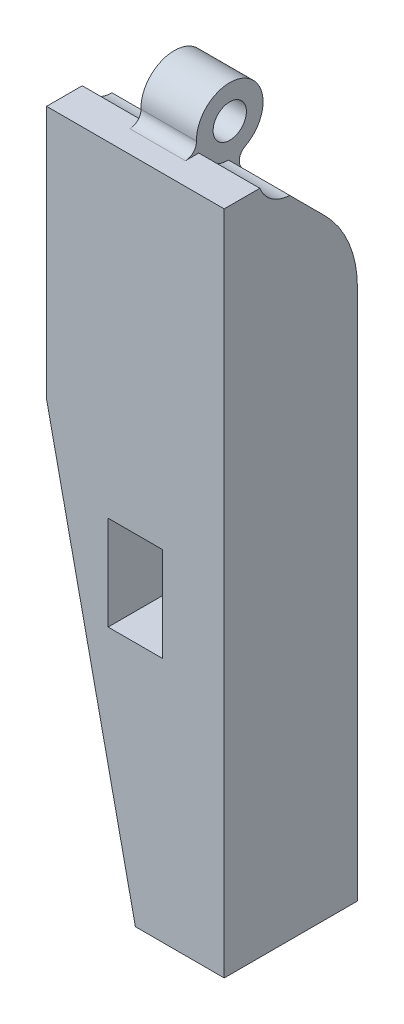
ISO-10303-21;
HEADER;
FILE_DESCRIPTION(('STEP AP214'),'2;1');
FILE_NAME('part.step','',(''),(''),'','','');
FILE_SCHEMA(('AUTOMOTIVE_DESIGN { 1 0 10303 214 1 1 1 1 }'));
ENDSEC;
DATA;
#1=APPLICATION_CONTEXT('core data for automotive mechanical design processes');
#2=APPLICATION_PROTOCOL_DEFINITION('international standard','automotive_design',2000,#1);
#3=PRODUCT_CONTEXT('',#1,'mechanical');
#4=PRODUCT('Part','Part','',(#3));
#5=PRODUCT_RELATED_PRODUCT_CATEGORY('part','',(#4));
#6=PRODUCT_DEFINITION_FORMATION('','',#4);
#7=PRODUCT_DEFINITION_CONTEXT('part definition',#1,'design');
#8=PRODUCT_DEFINITION('design','',#6,#7);
#9=PRODUCT_DEFINITION_SHAPE('','',#8);
#10=(LENGTH_UNIT() NAMED_UNIT(*) SI_UNIT(.MILLI.,.METRE.));
#11=(NAMED_UNIT(*) PLANE_ANGLE_UNIT() SI_UNIT($,.RADIAN.));
#12=(NAMED_UNIT(*) SI_UNIT($,.STERADIAN.) SOLID_ANGLE_UNIT());
#13=UNCERTAINTY_MEASURE_WITH_UNIT(LENGTH_MEASURE(1.E-05),#10,'distance_accuracy_value','');
#14=(GEOMETRIC_REPRESENTATION_CONTEXT(3) GLOBAL_UNCERTAINTY_ASSIGNED_CONTEXT((#13)) GLOBAL_UNIT_ASSIGNED_CONTEXT((#10,
#11,#12)) REPRESENTATION_CONTEXT('',''));
#15=CARTESIAN_POINT('',(0.,0.,0.));
#16=DIRECTION('',(0.,0.,1.));
#17=DIRECTION('',(1.,0.,0.));
#18=AXIS2_PLACEMENT_3D('',#15,#16,#17);
#19=CARTESIAN_POINT('',(0.,-29.3580775066502,5.));
#20=DIRECTION('',(0.,-1.,0.));
#21=DIRECTION('',(0.,0.,-1.));
#22=AXIS2_PLACEMENT_3D('',#19,#20,#21);
#23=PLANE('',#22);
#24=DIRECTION('',(-1.,0.,0.));
#25=VECTOR('',#24,1.);
#26=CARTESIAN_POINT('',(2.45664929848685,-29.3580775066502,2.5));
#27=LINE('',#26,#25);
#28=CARTESIAN_POINT('',(2.45664929848685,-29.3580775066502,2.5));
#29=VERTEX_POINT('',#28);
#30=CARTESIAN_POINT('',(-2.45664929848684,-29.3580775066502,2.5));
#31=VERTEX_POINT('',#30);
#32=EDGE_CURVE('E202',#29,#31,#27,.T.);
#33=ORIENTED_EDGE('',*,*,#32,.T.);
#34=DIRECTION('',(0.,0.,-1.));
#35=VECTOR('',#34,1.);
#36=CARTESIAN_POINT('',(-2.45664929848684,-29.3580775066502,5.));
#37=LINE('',#36,#35);
#38=CARTESIAN_POINT('',(-2.45664929848684,-29.3580775066502,0.));
#39=VERTEX_POINT('',#38);
#40=EDGE_CURVE('E214',#31,#39,#37,.T.);
#41=ORIENTED_EDGE('',*,*,#40,.T.);
#42=DIRECTION('',(-1.,0.,0.));
#43=VECTOR('',#42,1.);
#44=CARTESIAN_POINT('',(0.,-29.3580775066502,0.));
#45=LINE('',#44,#43);
#46=CARTESIAN_POINT('',(2.45664929848685,-29.3580775066502,0.));
#47=VERTEX_POINT('',#46);
#48=EDGE_CURVE('E496',#47,#39,#45,.T.);
#49=ORIENTED_EDGE('',*,*,#48,.F.);
#50=DIRECTION('',(0.,0.,-1.));
#51=VECTOR('',#50,1.);
#52=CARTESIAN_POINT('',(2.45664929848685,-29.3580775066502,5.));
#53=LINE('',#52,#51);
#54=EDGE_CURVE('E216',#29,#47,#53,.T.);
#55=ORIENTED_EDGE('',*,*,#54,.F.);
#56=EDGE_LOOP('',(#33,#41,#49,#55));
#57=FACE_BOUND('',#56,.T.);
#58=ADVANCED_FACE('F38',(#57),#23,.T.);
#59=CARTESIAN_POINT('',(0.,0.,0.));
#60=DIRECTION('',(0.,0.,1.));
#61=DIRECTION('',(1.,0.,0.));
#62=AXIS2_PLACEMENT_3D('',#59,#60,#61);
#63=PLANE('',#62);
#64=DIRECTION('',(0.,-1.,0.));
#65=VECTOR('',#64,1.);
#66=CARTESIAN_POINT('',(-2.45664929848684,0.,0.));
#67=LINE('',#66,#65);
#68=CARTESIAN_POINT('',(-2.45664929848684,-37.8516487579866,0.));
#69=VERTEX_POINT('',#68);
#70=EDGE_CURVE('E221',#39,#69,#67,.T.);
#71=ORIENTED_EDGE('',*,*,#70,.T.);
#72=DIRECTION('',(-1.,0.,0.));
#73=VECTOR('',#72,1.);
#74=CARTESIAN_POINT('',(0.,-37.8516487579866,0.));
#75=LINE('',#74,#73);
#76=CARTESIAN_POINT('',(2.45664929848685,-37.8516487579866,0.));
#77=VERTEX_POINT('',#76);
#78=EDGE_CURVE('E225',#77,#69,#75,.T.);
#79=ORIENTED_EDGE('',*,*,#78,.F.);
#80=DIRECTION('',(0.,-1.,0.));
#81=VECTOR('',#80,1.);
#82=CARTESIAN_POINT('',(2.45664929848685,0.,0.));
#83=LINE('',#82,#81);
#84=EDGE_CURVE('E230',#47,#77,#83,.T.);
#85=ORIENTED_EDGE('',*,*,#84,.F.);
#86=ORIENTED_EDGE('',*,*,#48,.T.);
#87=EDGE_LOOP('',(#71,#79,#85,#86));
#88=FACE_BOUND('',#87,.T.);
#89=DIRECTION('',(0.,1.,0.));
#90=VECTOR('',#89,1.);
#91=CARTESIAN_POINT('',(2.45664929848685,0.,0.));
#92=LINE('',#91,#90);
#93=CARTESIAN_POINT('',(2.45664929848685,-20.4574129456105,0.));
#94=VERTEX_POINT('',#93);
#95=CARTESIAN_POINT('',(2.45664929848685,-12.142135623731,0.));
#96=VERTEX_POINT('',#95);
#97=EDGE_CURVE('E481',#94,#96,#92,.T.);
#98=ORIENTED_EDGE('',*,*,#97,.T.);
#99=DIRECTION('',(1.,0.,0.));
#100=VECTOR('',#99,1.);
#101=CARTESIAN_POINT('',(0.,-12.142135623731,0.));
#102=LINE('',#101,#100);
#103=CARTESIAN_POINT('',(8.,-12.142135623731,0.));
#104=VERTEX_POINT('',#103);
#105=EDGE_CURVE('E372',#96,#104,#102,.T.);
#106=ORIENTED_EDGE('',*,*,#105,.T.);
#107=DIRECTION('',(0.,1.,0.));
#108=VECTOR('',#107,1.);
#109=CARTESIAN_POINT('',(8.,0.,0.));
#110=LINE('',#109,#108);
#111=CARTESIAN_POINT('',(8.00000000000001,-60.,0.));
#112=VERTEX_POINT('',#111);
#113=EDGE_CURVE('E291',#112,#104,#110,.T.);
#114=ORIENTED_EDGE('',*,*,#113,.F.);
#115=DIRECTION('',(1.,0.,0.));
#116=VECTOR('',#115,1.);
#117=CARTESIAN_POINT('',(-8.,-60.,0.));
#118=LINE('',#117,#116);
#119=CARTESIAN_POINT('',(0.,-60.,0.));
#120=VERTEX_POINT('',#119);
#121=EDGE_CURVE('E297',#120,#112,#118,.T.);
#122=ORIENTED_EDGE('',*,*,#121,.F.);
#123=DIRECTION('',(0.210526315789474,-0.977588190579301,0.));
#124=VECTOR('',#123,1.);
#125=CARTESIAN_POINT('',(0.,-60.,0.));
#126=LINE('',#125,#124);
#127=CARTESIAN_POINT('',(-8.,-22.8516487579866,0.));
#128=VERTEX_POINT('',#127);
#129=EDGE_CURVE('E241',#128,#120,#126,.T.);
#130=ORIENTED_EDGE('',*,*,#129,.F.);
#131=DIRECTION('',(0.,-1.,0.));
#132=VECTOR('',#131,1.);
#133=CARTESIAN_POINT('',(-8.,0.,0.));
#134=LINE('',#133,#132);
#135=CARTESIAN_POINT('',(-8.,-12.142135623731,0.));
#136=VERTEX_POINT('',#135);
#137=EDGE_CURVE('E311',#136,#128,#134,.T.);
#138=ORIENTED_EDGE('',*,*,#137,.F.);
#139=CARTESIAN_POINT('',(-2.45664929848684,-12.142135623731,0.));
#140=VERTEX_POINT('',#139);
#141=EDGE_CURVE('E373',#136,#140,#102,.T.);
#142=ORIENTED_EDGE('',*,*,#141,.T.);
#143=DIRECTION('',(0.,1.,0.));
#144=VECTOR('',#143,1.);
#145=CARTESIAN_POINT('',(-2.45664929848684,0.,0.));
#146=LINE('',#145,#144);
#147=CARTESIAN_POINT('',(-2.45664929848684,-20.4574129456105,0.));
#148=VERTEX_POINT('',#147);
#149=EDGE_CURVE('E402',#148,#140,#146,.T.);
#150=ORIENTED_EDGE('',*,*,#149,.F.);
#151=DIRECTION('',(-1.,0.,0.));
#152=VECTOR('',#151,1.);
#153=CARTESIAN_POINT('',(0.,-20.4574129456105,0.));
#154=LINE('',#153,#152);
#155=EDGE_CURVE('E477',#94,#148,#154,.T.);
#156=ORIENTED_EDGE('',*,*,#155,.F.);
#157=EDGE_LOOP('',(#98,#106,#114,#122,#130,#138,#142,#150,#156));
#158=FACE_BOUND('',#157,.T.);
#159=ADVANCED_FACE('F400',(#88,#158),#63,.F.);
#160=CARTESIAN_POINT('',(-8.,1.1,6.));
#161=DIRECTION('',(1.,0.,0.));
#162=DIRECTION('',(0.,0.,-1.));
#163=AXIS2_PLACEMENT_3D('',#160,#161,#162);
#164=CYLINDRICAL_SURFACE('',#163,3.);
#165=CARTESIAN_POINT('',(-2.5,1.1,6.));
#166=DIRECTION('',(1.,0.,0.));
#167=DIRECTION('',(0.,0.,-1.));
#168=AXIS2_PLACEMENT_3D('',#165,#166,#167);
#169=CIRCLE('',#168,3.);
#170=CARTESIAN_POINT('',(-2.5,0.,8.79105714739057));
#171=VERTEX_POINT('',#170);
#172=CARTESIAN_POINT('',(-2.5,-1.89827483579602,6.10172516420397));
#173=VERTEX_POINT('',#172);
#174=EDGE_CURVE('E267',#171,#173,#169,.T.);
#175=ORIENTED_EDGE('',*,*,#174,.T.);
#176=DIRECTION('',(1.,0.,0.));
#177=VECTOR('',#176,1.);
#178=CARTESIAN_POINT('',(-8.,-1.89827483579602,6.10172516420397));
#179=LINE('',#178,#177);
#180=CARTESIAN_POINT('',(-8.,-1.89827483579602,6.10172516420397));
#181=VERTEX_POINT('',#180);
#182=EDGE_CURVE('E328',#181,#173,#179,.T.);
#183=ORIENTED_EDGE('',*,*,#182,.F.);
#184=CARTESIAN_POINT('',(-8.,1.1,6.));
#185=DIRECTION('',(1.,0.,0.));
#186=DIRECTION('',(0.,0.,-1.));
#187=AXIS2_PLACEMENT_3D('',#184,#185,#186);
#188=CIRCLE('',#187,3.);
#189=CARTESIAN_POINT('',(-8.,0.,8.79105714739057));
#190=VERTEX_POINT('',#189);
#191=EDGE_CURVE('E274',#190,#181,#188,.T.);
#192=ORIENTED_EDGE('',*,*,#191,.F.);
#193=DIRECTION('',(1.,0.,0.));
#194=VECTOR('',#193,1.);
#195=CARTESIAN_POINT('',(-8.,0.,8.79105714739057));
#196=LINE('',#195,#194);
#197=EDGE_CURVE('E278',#171,#190,#196,.F.);
#198=ORIENTED_EDGE('',*,*,#197,.F.);
#199=EDGE_LOOP('',(#175,#183,#192,#198));
#200=FACE_BOUND('',#199,.T.);
#201=ADVANCED_FACE('F429',(#200),#164,.F.);
#202=CARTESIAN_POINT('',(8.,0.,12.));
#203=DIRECTION('',(-1.,0.,0.));
#204=DIRECTION('',(0.,-1.,0.));
#205=AXIS2_PLACEMENT_3D('',#202,#203,#204);
#206=PLANE('',#205);
#207=ORIENTED_EDGE('',*,*,#113,.T.);
#208=CARTESIAN_POINT('',(8.,-12.142135623731,10.));
#209=DIRECTION('',(-1.,0.,0.));
#210=DIRECTION('',(0.,-1.,0.));
#211=AXIS2_PLACEMENT_3D('',#208,#209,#210);
#212=CIRCLE('',#211,10.);
#213=CARTESIAN_POINT('',(8.00000000000001,-5.07106781186548,2.92893218813452));
#214=VERTEX_POINT('',#213);
#215=EDGE_CURVE('E377',#104,#214,#212,.F.);
#216=ORIENTED_EDGE('',*,*,#215,.T.);
#217=DIRECTION('',(0.,-0.707106781186548,-0.707106781186547));
#218=VECTOR('',#217,1.);
#219=CARTESIAN_POINT('',(8.00000000000001,0.,8.));
#220=LINE('',#219,#218);
#221=CARTESIAN_POINT('',(8.00000000000001,-1.89827483579602,6.10172516420397));
#222=VERTEX_POINT('',#221);
#223=EDGE_CURVE('E283',#222,#214,#220,.T.);
#224=ORIENTED_EDGE('',*,*,#223,.F.);
#225=CARTESIAN_POINT('',(8.00000000000001,1.1,6.));
#226=DIRECTION('',(1.,0.,0.));
#227=DIRECTION('',(0.,0.,-1.));
#228=AXIS2_PLACEMENT_3D('',#225,#226,#227);
#229=CIRCLE('',#228,3.);
#230=CARTESIAN_POINT('',(8.00000000000001,0.,8.79105714739057));
#231=VERTEX_POINT('',#230);
#232=EDGE_CURVE('E265',#231,#222,#229,.T.);
#233=ORIENTED_EDGE('',*,*,#232,.F.);
#234=DIRECTION('',(0.,0.,-1.));
#235=VECTOR('',#234,1.);
#236=CARTESIAN_POINT('',(8.,0.,12.));
#237=LINE('',#236,#235);
#238=CARTESIAN_POINT('',(8.,0.,12.));
#239=VERTEX_POINT('',#238);
#240=EDGE_CURVE('E323',#239,#231,#237,.T.);
#241=ORIENTED_EDGE('',*,*,#240,.F.);
#242=DIRECTION('',(0.,1.,0.));
#243=VECTOR('',#242,1.);
#244=CARTESIAN_POINT('',(8.,0.,12.));
#245=LINE('',#244,#243);
#246=CARTESIAN_POINT('',(8.00000000000001,-60.,12.));
#247=VERTEX_POINT('',#246);
#248=EDGE_CURVE('E292',#247,#239,#245,.T.);
#249=ORIENTED_EDGE('',*,*,#248,.F.);
#250=DIRECTION('',(0.,0.,-1.));
#251=VECTOR('',#250,1.);
#252=CARTESIAN_POINT('',(8.00000000000001,-60.,12.));
#253=LINE('',#252,#251);
#254=EDGE_CURVE('E307',#247,#112,#253,.T.);
#255=ORIENTED_EDGE('',*,*,#254,.T.);
#256=EDGE_LOOP('',(#207,#216,#224,#233,#241,#249,#255));
#257=FACE_BOUND('',#256,.T.);
#258=ADVANCED_FACE('F419',(#257),#206,.F.);
#259=CARTESIAN_POINT('',(-8.,0.,12.));
#260=DIRECTION('',(0.,-1.,0.));
#261=DIRECTION('',(1.,0.,0.));
#262=AXIS2_PLACEMENT_3D('',#259,#260,#261);
#263=PLANE('',#262);
#264=DIRECTION('',(1.,0.,0.));
#265=VECTOR('',#264,1.);
#266=CARTESIAN_POINT('',(-2.5,0.,9.99874980462644));
#267=LINE('',#266,#265);
#268=CARTESIAN_POINT('',(2.5,0.,9.99874980462644));
#269=VERTEX_POINT('',#268);
#270=CARTESIAN_POINT('',(-2.5,0.,9.99874980462644));
#271=VERTEX_POINT('',#270);
#272=EDGE_CURVE('E336',#269,#271,#267,.F.);
#273=ORIENTED_EDGE('',*,*,#272,.T.);
#274=DIRECTION('',(0.,0.,-1.));
#275=VECTOR('',#274,1.);
#276=CARTESIAN_POINT('',(-2.5,0.,6.));
#277=LINE('',#276,#275);
#278=EDGE_CURVE('E340',#271,#171,#277,.T.);
#279=ORIENTED_EDGE('',*,*,#278,.T.);
#280=ORIENTED_EDGE('',*,*,#197,.T.);
#281=DIRECTION('',(0.,0.,-1.));
#282=VECTOR('',#281,1.);
#283=CARTESIAN_POINT('',(-8.,0.,12.));
#284=LINE('',#283,#282);
#285=CARTESIAN_POINT('',(-8.,0.,12.));
#286=VERTEX_POINT('',#285);
#287=EDGE_CURVE('E319',#286,#190,#284,.T.);
#288=ORIENTED_EDGE('',*,*,#287,.F.);
#289=DIRECTION('',(-1.,0.,0.));
#290=VECTOR('',#289,1.);
#291=CARTESIAN_POINT('',(-8.,0.,12.));
#292=LINE('',#291,#290);
#293=EDGE_CURVE('E296',#239,#286,#292,.T.);
#294=ORIENTED_EDGE('',*,*,#293,.F.);
#295=ORIENTED_EDGE('',*,*,#240,.T.);
#296=CARTESIAN_POINT('',(2.5,0.,8.79105714739057));
#297=VERTEX_POINT('',#296);
#298=EDGE_CURVE('E279',#231,#297,#196,.F.);
#299=ORIENTED_EDGE('',*,*,#298,.T.);
#300=DIRECTION('',(0.,0.,1.));
#301=VECTOR('',#300,1.);
#302=CARTESIAN_POINT('',(2.5,0.,12.));
#303=LINE('',#302,#301);
#304=EDGE_CURVE('E332',#297,#269,#303,.T.);
#305=ORIENTED_EDGE('',*,*,#304,.T.);
#306=EDGE_LOOP('',(#273,#279,#280,#288,#294,#295,#299,#305));
#307=FACE_BOUND('',#306,.T.);
#308=ADVANCED_FACE('F423',(#307),#263,.F.);
#309=CARTESIAN_POINT('',(-8.,0.,12.));
#310=DIRECTION('',(1.,0.,0.));
#311=DIRECTION('',(0.,0.,-1.));
#312=AXIS2_PLACEMENT_3D('',#309,#310,#311);
#313=PLANE('',#312);
#314=DIRECTION('',(0.,-0.707106781186548,-0.707106781186547));
#315=VECTOR('',#314,1.);
#316=CARTESIAN_POINT('',(-8.,0.,8.));
#317=LINE('',#316,#315);
#318=CARTESIAN_POINT('',(-8.,-5.07106781186548,2.92893218813452));
#319=VERTEX_POINT('',#318);
#320=EDGE_CURVE('E287',#181,#319,#317,.T.);
#321=ORIENTED_EDGE('',*,*,#320,.T.);
#322=CARTESIAN_POINT('',(-8.,-12.142135623731,10.));
#323=DIRECTION('',(1.,0.,0.));
#324=DIRECTION('',(0.,0.,-1.));
#325=AXIS2_PLACEMENT_3D('',#322,#323,#324);
#326=CIRCLE('',#325,10.);
#327=EDGE_CURVE('E11',#319,#136,#326,.F.);
#328=ORIENTED_EDGE('',*,*,#327,.T.);
#329=ORIENTED_EDGE('',*,*,#137,.T.);
#330=DIRECTION('',(0.,0.,-1.));
#331=VECTOR('',#330,1.);
#332=CARTESIAN_POINT('',(-8.,-22.8516487579866,12.));
#333=LINE('',#332,#331);
#334=CARTESIAN_POINT('',(-8.,-22.8516487579866,12.));
#335=VERTEX_POINT('',#334);
#336=EDGE_CURVE('E240',#335,#128,#333,.T.);
#337=ORIENTED_EDGE('',*,*,#336,.F.);
#338=DIRECTION('',(0.,-1.,0.));
#339=VECTOR('',#338,1.);
#340=CARTESIAN_POINT('',(-8.,0.,12.));
#341=LINE('',#340,#339);
#342=EDGE_CURVE('E300',#286,#335,#341,.T.);
#343=ORIENTED_EDGE('',*,*,#342,.F.);
#344=ORIENTED_EDGE('',*,*,#287,.T.);
#345=ORIENTED_EDGE('',*,*,#191,.T.);
#346=EDGE_LOOP('',(#321,#328,#329,#337,#343,#344,#345));
#347=FACE_BOUND('',#346,.T.);
#348=ADVANCED_FACE('F389',(#347),#313,.F.);
#349=CARTESIAN_POINT('',(-8.,-60.,12.));
#350=DIRECTION('',(0.,1.,0.));
#351=DIRECTION('',(0.,0.,1.));
#352=AXIS2_PLACEMENT_3D('',#349,#350,#351);
#353=PLANE('',#352);
#354=DIRECTION('',(1.,0.,0.));
#355=VECTOR('',#354,1.);
#356=CARTESIAN_POINT('',(-8.,-60.,12.));
#357=LINE('',#356,#355);
#358=CARTESIAN_POINT('',(0.,-60.,12.));
#359=VERTEX_POINT('',#358);
#360=EDGE_CURVE('E304',#359,#247,#357,.T.);
#361=ORIENTED_EDGE('',*,*,#360,.F.);
#362=DIRECTION('',(0.,0.,-1.));
#363=VECTOR('',#362,1.);
#364=CARTESIAN_POINT('',(0.,-60.,12.));
#365=LINE('',#364,#363);
#366=EDGE_CURVE('E245',#359,#120,#365,.T.);
#367=ORIENTED_EDGE('',*,*,#366,.T.);
#368=ORIENTED_EDGE('',*,*,#121,.T.);
#369=ORIENTED_EDGE('',*,*,#254,.F.);
#370=EDGE_LOOP('',(#361,#367,#368,#369));
#371=FACE_BOUND('',#370,.T.);
#372=ADVANCED_FACE('F414',(#371),#353,.F.);
#373=CARTESIAN_POINT('',(0.,0.,12.));
#374=DIRECTION('',(0.,0.,1.));
#375=DIRECTION('',(1.,0.,0.));
#376=AXIS2_PLACEMENT_3D('',#373,#374,#375);
#377=PLANE('',#376);
#378=DIRECTION('',(0.,-1.,0.));
#379=VECTOR('',#378,1.);
#380=CARTESIAN_POINT('',(2.45664929848685,-29.3580775066502,12.));
#381=LINE('',#380,#379);
#382=CARTESIAN_POINT('',(2.45664929848685,-29.3580775066502,12.));
#383=VERTEX_POINT('',#382);
#384=CARTESIAN_POINT('',(2.45664929848685,-37.8516487579866,12.));
#385=VERTEX_POINT('',#384);
#386=EDGE_CURVE('E517',#383,#385,#381,.T.);
#387=ORIENTED_EDGE('',*,*,#386,.T.);
#388=DIRECTION('',(-1.,0.,0.));
#389=VECTOR('',#388,1.);
#390=CARTESIAN_POINT('',(2.45664929848685,-37.8516487579866,12.));
#391=LINE('',#390,#389);
#392=CARTESIAN_POINT('',(-2.45664929848684,-37.8516487579866,12.));
#393=VERTEX_POINT('',#392);
#394=EDGE_CURVE('E513',#385,#393,#391,.T.);
#395=ORIENTED_EDGE('',*,*,#394,.T.);
#396=DIRECTION('',(0.,1.,0.));
#397=VECTOR('',#396,1.);
#398=CARTESIAN_POINT('',(-2.45664929848684,-29.3580775066502,12.));
#399=LINE('',#398,#397);
#400=CARTESIAN_POINT('',(-2.45664929848684,-29.3580775066502,12.));
#401=VERTEX_POINT('',#400);
#402=EDGE_CURVE('E509',#393,#401,#399,.T.);
#403=ORIENTED_EDGE('',*,*,#402,.T.);
#404=DIRECTION('',(1.,0.,0.));
#405=VECTOR('',#404,1.);
#406=CARTESIAN_POINT('',(2.45664929848685,-29.3580775066502,12.));
#407=LINE('',#406,#405);
#408=EDGE_CURVE('E504',#401,#383,#407,.T.);
#409=ORIENTED_EDGE('',*,*,#408,.T.);
#410=EDGE_LOOP('',(#387,#395,#403,#409));
#411=FACE_BOUND('',#410,.T.);
#412=DIRECTION('',(0.210526315789474,-0.977588190579301,0.));
#413=VECTOR('',#412,1.);
#414=CARTESIAN_POINT('',(0.,-60.,12.));
#415=LINE('',#414,#413);
#416=EDGE_CURVE('E236',#335,#359,#415,.T.);
#417=ORIENTED_EDGE('',*,*,#416,.T.);
#418=ORIENTED_EDGE('',*,*,#360,.T.);
#419=ORIENTED_EDGE('',*,*,#248,.T.);
#420=ORIENTED_EDGE('',*,*,#293,.T.);
#421=ORIENTED_EDGE('',*,*,#342,.T.);
#422=EDGE_LOOP('',(#417,#418,#419,#420,#421));
#423=FACE_BOUND('',#422,.T.);
#424=ADVANCED_FACE('F411',(#411,#423),#377,.T.);
#425=CARTESIAN_POINT('',(-8.,0.,8.));
#426=DIRECTION('',(0.,-0.707106781186547,0.707106781186548));
#427=DIRECTION('',(0.,-0.707106781186548,-0.707106781186547));
#428=AXIS2_PLACEMENT_3D('',#425,#426,#427);
#429=PLANE('',#428);
#430=ORIENTED_EDGE('',*,*,#223,.T.);
#431=DIRECTION('',(1.,0.,0.));
#432=VECTOR('',#431,1.);
#433=CARTESIAN_POINT('',(-8.,-5.07106781186548,2.92893218813452));
#434=LINE('',#433,#432);
#435=EDGE_CURVE('E47',#214,#319,#434,.F.);
#436=ORIENTED_EDGE('',*,*,#435,.T.);
#437=ORIENTED_EDGE('',*,*,#320,.F.);
#438=ORIENTED_EDGE('',*,*,#182,.T.);
#439=DIRECTION('',(0.,-0.707106781186548,-0.707106781186547));
#440=VECTOR('',#439,1.);
#441=CARTESIAN_POINT('',(-2.5,-0.449999999999998,7.55));
#442=LINE('',#441,#440);
#443=CARTESIAN_POINT('',(-2.5,-3.14991315076583,4.85008684923416));
#444=VERTEX_POINT('',#443);
#445=EDGE_CURVE('E349',#173,#444,#442,.T.);
#446=ORIENTED_EDGE('',*,*,#445,.T.);
#447=DIRECTION('',(1.,0.,0.));
#448=VECTOR('',#447,1.);
#449=CARTESIAN_POINT('',(2.5,-3.14991315076583,4.85008684923416));
#450=LINE('',#449,#448);
#451=CARTESIAN_POINT('',(2.5,-3.14991315076583,4.85008684923416));
#452=VERTEX_POINT('',#451);
#453=EDGE_CURVE('E353',#444,#452,#450,.T.);
#454=ORIENTED_EDGE('',*,*,#453,.T.);
#455=DIRECTION('',(0.,0.707106781186548,0.707106781186547));
#456=VECTOR('',#455,1.);
#457=CARTESIAN_POINT('',(2.5,0.,8.));
#458=LINE('',#457,#456);
#459=CARTESIAN_POINT('',(2.5,-1.89827483579602,6.10172516420397));
#460=VERTEX_POINT('',#459);
#461=EDGE_CURVE('E357',#452,#460,#458,.T.);
#462=ORIENTED_EDGE('',*,*,#461,.T.);
#463=EDGE_CURVE('E327',#460,#222,#179,.T.);
#464=ORIENTED_EDGE('',*,*,#463,.T.);
#465=EDGE_LOOP('',(#430,#436,#437,#438,#446,#454,#462,#464));
#466=FACE_BOUND('',#465,.T.);
#467=ADVANCED_FACE('F383',(#466),#429,.F.);
#468=ORIENTED_EDGE('',*,*,#463,.F.);
#469=CARTESIAN_POINT('',(2.5,1.1,6.));
#470=DIRECTION('',(1.,0.,0.));
#471=DIRECTION('',(0.,0.,-1.));
#472=AXIS2_PLACEMENT_3D('',#469,#470,#471);
#473=CIRCLE('',#472,3.);
#474=EDGE_CURVE('E261',#297,#460,#473,.T.);
#475=ORIENTED_EDGE('',*,*,#474,.F.);
#476=ORIENTED_EDGE('',*,*,#298,.F.);
#477=ORIENTED_EDGE('',*,*,#232,.T.);
#478=EDGE_LOOP('',(#468,#475,#476,#477));
#479=FACE_BOUND('',#478,.T.);
#480=ADVANCED_FACE('F445',(#479),#164,.F.);
#481=CARTESIAN_POINT('',(2.5,1.1,6.));
#482=DIRECTION('',(-1.,0.,0.));
#483=DIRECTION('',(0.,0.,1.));
#484=AXIS2_PLACEMENT_3D('',#481,#482,#483);
#485=CYLINDRICAL_SURFACE('',#484,3.);
#486=CARTESIAN_POINT('',(-2.5,-1.55710477718447,4.60723505103571));
#487=VERTEX_POINT('',#486);
#488=CARTESIAN_POINT('',(-2.5,1.025,8.99906235346983));
#489=VERTEX_POINT('',#488);
#490=EDGE_CURVE('E257',#487,#489,#169,.T.);
#491=ORIENTED_EDGE('',*,*,#490,.T.);
#492=DIRECTION('',(-1.,0.,0.));
#493=VECTOR('',#492,1.);
#494=CARTESIAN_POINT('',(2.5,1.025,8.99906235346983));
#495=LINE('',#494,#493);
#496=CARTESIAN_POINT('',(2.5,1.025,8.99906235346983));
#497=VERTEX_POINT('',#496);
#498=EDGE_CURVE('E346',#489,#497,#495,.F.);
#499=ORIENTED_EDGE('',*,*,#498,.T.);
#500=CARTESIAN_POINT('',(2.5,-1.55710477718447,4.60723505103571));
#501=VERTEX_POINT('',#500);
#502=EDGE_CURVE('E266',#501,#497,#473,.T.);
#503=ORIENTED_EDGE('',*,*,#502,.F.);
#504=DIRECTION('',(-1.,0.,0.));
#505=VECTOR('',#504,1.);
#506=CARTESIAN_POINT('',(2.5,-1.55710477718447,4.60723505103571));
#507=LINE('',#506,#505);
#508=EDGE_CURVE('E343',#501,#487,#507,.T.);
#509=ORIENTED_EDGE('',*,*,#508,.T.);
#510=EDGE_LOOP('',(#491,#499,#503,#509));
#511=FACE_BOUND('',#510,.T.);
#512=ADVANCED_FACE('F590',(#511),#485,.T.);
#513=CARTESIAN_POINT('',(2.5,1.1,6.));
#514=DIRECTION('',(1.,0.,0.));
#515=DIRECTION('',(0.,0.,-1.));
#516=AXIS2_PLACEMENT_3D('',#513,#514,#515);
#517=PLANE('',#516);
#518=ORIENTED_EDGE('',*,*,#474,.T.);
#519=ORIENTED_EDGE('',*,*,#461,.F.);
#520=CARTESIAN_POINT('',(2.5,-2.44280636957929,4.14298006804762));
#521=DIRECTION('',(1.,0.,0.));
#522=DIRECTION('',(0.,0.,-1.));
#523=AXIS2_PLACEMENT_3D('',#520,#521,#522);
#524=CIRCLE('',#523,1.);
#525=EDGE_CURVE('E366',#452,#501,#524,.F.);
#526=ORIENTED_EDGE('',*,*,#525,.T.);
#527=ORIENTED_EDGE('',*,*,#502,.T.);
#528=CARTESIAN_POINT('',(2.5,1.,9.99874980462644));
#529=DIRECTION('',(1.,0.,0.));
#530=DIRECTION('',(0.,0.,-1.));
#531=AXIS2_PLACEMENT_3D('',#528,#529,#530);
#532=CIRCLE('',#531,1.);
#533=EDGE_CURVE('E363',#497,#269,#532,.F.);
#534=ORIENTED_EDGE('',*,*,#533,.T.);
#535=ORIENTED_EDGE('',*,*,#304,.F.);
#536=EDGE_LOOP('',(#518,#519,#526,#527,#534,#535));
#537=FACE_BOUND('',#536,.T.);
#538=CARTESIAN_POINT('',(2.5,1.1,6.));
#539=DIRECTION('',(1.,0.,0.));
#540=DIRECTION('',(0.,0.,-1.));
#541=AXIS2_PLACEMENT_3D('',#538,#539,#540);
#542=CIRCLE('',#541,1.5);
#543=CARTESIAN_POINT('',(2.5,1.1,4.5));
#544=VERTEX_POINT('',#543);
#545=EDGE_CURVE('E253',#544,#544,#542,.T.);
#546=ORIENTED_EDGE('',*,*,#545,.F.);
#547=EDGE_LOOP('',(#546));
#548=FACE_BOUND('',#547,.T.);
#549=ADVANCED_FACE('F440',(#537,#548),#517,.T.);
#550=CARTESIAN_POINT('',(-2.5,1.1,6.));
#551=DIRECTION('',(1.,0.,0.));
#552=DIRECTION('',(0.,0.,-1.));
#553=AXIS2_PLACEMENT_3D('',#550,#551,#552);
#554=PLANE('',#553);
#555=ORIENTED_EDGE('',*,*,#174,.F.);
#556=ORIENTED_EDGE('',*,*,#278,.F.);
#557=CARTESIAN_POINT('',(-2.5,1.,9.99874980462644));
#558=DIRECTION('',(1.,0.,0.));
#559=DIRECTION('',(0.,0.,-1.));
#560=AXIS2_PLACEMENT_3D('',#557,#558,#559);
#561=CIRCLE('',#560,1.);
#562=EDGE_CURVE('E360',#271,#489,#561,.T.);
#563=ORIENTED_EDGE('',*,*,#562,.T.);
#564=ORIENTED_EDGE('',*,*,#490,.F.);
#565=CARTESIAN_POINT('',(-2.5,-2.44280636957929,4.14298006804762));
#566=DIRECTION('',(1.,0.,0.));
#567=DIRECTION('',(0.,0.,-1.));
#568=AXIS2_PLACEMENT_3D('',#565,#566,#567);
#569=CIRCLE('',#568,1.);
#570=EDGE_CURVE('E369',#487,#444,#569,.T.);
#571=ORIENTED_EDGE('',*,*,#570,.T.);
#572=ORIENTED_EDGE('',*,*,#445,.F.);
#573=EDGE_LOOP('',(#555,#556,#563,#564,#571,#572));
#574=FACE_BOUND('',#573,.T.);
#575=CARTESIAN_POINT('',(-2.5,1.1,6.));
#576=DIRECTION('',(1.,0.,0.));
#577=DIRECTION('',(0.,0.,-1.));
#578=AXIS2_PLACEMENT_3D('',#575,#576,#577);
#579=CIRCLE('',#578,1.5);
#580=CARTESIAN_POINT('',(-2.5,1.1,4.5));
#581=VERTEX_POINT('',#580);
#582=EDGE_CURVE('E249',#581,#581,#579,.T.);
#583=ORIENTED_EDGE('',*,*,#582,.T.);
#584=EDGE_LOOP('',(#583));
#585=FACE_BOUND('',#584,.T.);
#586=ADVANCED_FACE('F586',(#574,#585),#554,.F.);
#587=CARTESIAN_POINT('',(2.5,1.1,6.));
#588=DIRECTION('',(-1.,0.,0.));
#589=DIRECTION('',(0.,0.,1.));
#590=AXIS2_PLACEMENT_3D('',#587,#588,#589);
#591=CYLINDRICAL_SURFACE('',#590,1.5);
#592=ORIENTED_EDGE('',*,*,#545,.T.);
#593=EDGE_LOOP('',(#592));
#594=FACE_BOUND('',#593,.T.);
#595=ORIENTED_EDGE('',*,*,#582,.F.);
#596=EDGE_LOOP('',(#595));
#597=FACE_BOUND('',#596,.T.);
#598=ADVANCED_FACE('F583',(#594,#597),#591,.F.);
#599=CARTESIAN_POINT('',(2.5,1.,9.99874980462644));
#600=DIRECTION('',(-1.,0.,0.));
#601=DIRECTION('',(0.,0.,1.));
#602=AXIS2_PLACEMENT_3D('',#599,#600,#601);
#603=CYLINDRICAL_SURFACE('',#602,1.);
#604=ORIENTED_EDGE('',*,*,#533,.F.);
#605=ORIENTED_EDGE('',*,*,#498,.F.);
#606=ORIENTED_EDGE('',*,*,#562,.F.);
#607=ORIENTED_EDGE('',*,*,#272,.F.);
#608=EDGE_LOOP('',(#604,#605,#606,#607));
#609=FACE_BOUND('',#608,.T.);
#610=ADVANCED_FACE('F581',(#609),#603,.F.);
#611=CARTESIAN_POINT('',(2.5,-2.44280636957929,4.14298006804762));
#612=DIRECTION('',(-1.,0.,0.));
#613=DIRECTION('',(0.,0.,1.));
#614=AXIS2_PLACEMENT_3D('',#611,#612,#613);
#615=CYLINDRICAL_SURFACE('',#614,1.);
#616=ORIENTED_EDGE('',*,*,#570,.F.);
#617=ORIENTED_EDGE('',*,*,#508,.F.);
#618=ORIENTED_EDGE('',*,*,#525,.F.);
#619=ORIENTED_EDGE('',*,*,#453,.F.);
#620=EDGE_LOOP('',(#616,#617,#618,#619));
#621=FACE_BOUND('',#620,.T.);
#622=ADVANCED_FACE('F434',(#621),#615,.F.);
#623=CARTESIAN_POINT('',(0.,-60.,12.));
#624=DIRECTION('',(0.9775881905793,0.210526315789474,0.));
#625=DIRECTION('',(-0.210526315789474,0.977588190579301,0.));
#626=AXIS2_PLACEMENT_3D('',#623,#624,#625);
#627=PLANE('',#626);
#628=ORIENTED_EDGE('',*,*,#129,.T.);
#629=ORIENTED_EDGE('',*,*,#366,.F.);
#630=ORIENTED_EDGE('',*,*,#416,.F.);
#631=ORIENTED_EDGE('',*,*,#336,.T.);
#632=EDGE_LOOP('',(#628,#629,#630,#631));
#633=FACE_BOUND('',#632,.T.);
#634=ADVANCED_FACE('F408',(#633),#627,.F.);
#635=CARTESIAN_POINT('',(0.,-12.142135623731,10.));
#636=DIRECTION('',(1.,0.,0.));
#637=DIRECTION('',(0.,0.,-1.));
#638=AXIS2_PLACEMENT_3D('',#635,#636,#637);
#639=CYLINDRICAL_SURFACE('',#638,10.);
#640=ORIENTED_EDGE('',*,*,#327,.F.);
#641=ORIENTED_EDGE('',*,*,#435,.F.);
#642=ORIENTED_EDGE('',*,*,#215,.F.);
#643=ORIENTED_EDGE('',*,*,#105,.F.);
#644=DIRECTION('',(1.,0.,0.));
#645=VECTOR('',#644,1.);
#646=CARTESIAN_POINT('',(0.,-12.142135623731,0.));
#647=LINE('',#646,#645);
#648=EDGE_CURVE('E396',#140,#96,#647,.T.);
#649=ORIENTED_EDGE('',*,*,#648,.F.);
#650=ORIENTED_EDGE('',*,*,#141,.F.);
#651=EDGE_LOOP('',(#640,#641,#642,#643,#649,#650));
#652=FACE_BOUND('',#651,.T.);
#653=ADVANCED_FACE('F40',(#652),#639,.T.);
#654=CARTESIAN_POINT('',(2.45664929848685,0.,5.));
#655=DIRECTION('',(-1.,0.,0.));
#656=DIRECTION('',(0.,-1.,0.));
#657=AXIS2_PLACEMENT_3D('',#654,#655,#656);
#658=PLANE('',#657);
#659=ORIENTED_EDGE('',*,*,#97,.F.);
#660=DIRECTION('',(0.,0.,-1.));
#661=VECTOR('',#660,1.);
#662=CARTESIAN_POINT('',(2.45664929848685,-20.4574129456105,5.));
#663=LINE('',#662,#661);
#664=CARTESIAN_POINT('',(2.45664929848685,-20.4574129456105,2.5));
#665=VERTEX_POINT('',#664);
#666=EDGE_CURVE('E459',#665,#94,#663,.T.);
#667=ORIENTED_EDGE('',*,*,#666,.F.);
#668=DIRECTION('',(0.,1.,0.));
#669=VECTOR('',#668,1.);
#670=CARTESIAN_POINT('',(2.45664929848685,-60.001,2.5));
#671=LINE('',#670,#669);
#672=EDGE_CURVE('E54',#29,#665,#671,.T.);
#673=ORIENTED_EDGE('',*,*,#672,.F.);
#674=ORIENTED_EDGE('',*,*,#54,.T.);
#675=ORIENTED_EDGE('',*,*,#84,.T.);
#676=DIRECTION('',(0.,0.,-1.));
#677=VECTOR('',#676,1.);
#678=CARTESIAN_POINT('',(2.45664929848685,-37.8516487579866,5.));
#679=LINE('',#678,#677);
#680=EDGE_CURVE('E486',#385,#77,#679,.T.);
#681=ORIENTED_EDGE('',*,*,#680,.F.);
#682=ORIENTED_EDGE('',*,*,#386,.F.);
#683=CARTESIAN_POINT('',(2.45664929848685,-29.3580775066502,5.));
#684=VERTEX_POINT('',#683);
#685=EDGE_CURVE('E234',#383,#684,#53,.T.);
#686=ORIENTED_EDGE('',*,*,#685,.T.);
#687=DIRECTION('',(0.,1.,0.));
#688=VECTOR('',#687,1.);
#689=CARTESIAN_POINT('',(2.45664929848685,0.,5.));
#690=LINE('',#689,#688);
#691=CARTESIAN_POINT('',(2.45664929848685,-12.142135623731,5.));
#692=VERTEX_POINT('',#691);
#693=EDGE_CURVE('E470',#684,#692,#690,.T.);
#694=ORIENTED_EDGE('',*,*,#693,.T.);
#695=DIRECTION('',(0.,0.,-1.));
#696=VECTOR('',#695,1.);
#697=CARTESIAN_POINT('',(2.45664929848685,-12.142135623731,5.));
#698=LINE('',#697,#696);
#699=EDGE_CURVE('E244',#692,#96,#698,.T.);
#700=ORIENTED_EDGE('',*,*,#699,.T.);
#701=EDGE_LOOP('',(#659,#667,#673,#674,#675,#681,#682,#686,#694,#700));
#702=FACE_BOUND('',#701,.T.);
#703=ADVANCED_FACE('F493',(#702),#658,.T.);
#704=CARTESIAN_POINT('',(0.,-12.142135623731,5.));
#705=DIRECTION('',(0.,1.,0.));
#706=DIRECTION('',(0.,0.,1.));
#707=AXIS2_PLACEMENT_3D('',#704,#705,#706);
#708=PLANE('',#707);
#709=ORIENTED_EDGE('',*,*,#648,.T.);
#710=ORIENTED_EDGE('',*,*,#699,.F.);
#711=DIRECTION('',(1.,0.,0.));
#712=VECTOR('',#711,1.);
#713=CARTESIAN_POINT('',(0.,-12.142135623731,5.));
#714=LINE('',#713,#712);
#715=CARTESIAN_POINT('',(-2.45664929848684,-12.142135623731,5.));
#716=VERTEX_POINT('',#715);
#717=EDGE_CURVE('E462',#716,#692,#714,.T.);
#718=ORIENTED_EDGE('',*,*,#717,.F.);
#719=DIRECTION('',(0.,0.,-1.));
#720=VECTOR('',#719,1.);
#721=CARTESIAN_POINT('',(-2.45664929848684,-12.142135623731,5.));
#722=LINE('',#721,#720);
#723=EDGE_CURVE('E452',#716,#140,#722,.T.);
#724=ORIENTED_EDGE('',*,*,#723,.T.);
#725=EDGE_LOOP('',(#709,#710,#718,#724));
#726=FACE_BOUND('',#725,.T.);
#727=ADVANCED_FACE('F538',(#726),#708,.F.);
#728=CARTESIAN_POINT('',(-2.45664929848684,0.,5.));
#729=DIRECTION('',(-1.,0.,0.));
#730=DIRECTION('',(0.,0.,1.));
#731=AXIS2_PLACEMENT_3D('',#728,#729,#730);
#732=PLANE('',#731);
#733=ORIENTED_EDGE('',*,*,#149,.T.);
#734=ORIENTED_EDGE('',*,*,#723,.F.);
#735=DIRECTION('',(0.,1.,0.));
#736=VECTOR('',#735,1.);
#737=CARTESIAN_POINT('',(-2.45664929848684,0.,5.));
#738=LINE('',#737,#736);
#739=CARTESIAN_POINT('',(-2.45664929848684,-29.3580775066502,5.));
#740=VERTEX_POINT('',#739);
#741=EDGE_CURVE('E466',#740,#716,#738,.T.);
#742=ORIENTED_EDGE('',*,*,#741,.F.);
#743=EDGE_CURVE('E224',#401,#740,#37,.T.);
#744=ORIENTED_EDGE('',*,*,#743,.F.);
#745=ORIENTED_EDGE('',*,*,#402,.F.);
#746=DIRECTION('',(0.,0.,-1.));
#747=VECTOR('',#746,1.);
#748=CARTESIAN_POINT('',(-2.45664929848684,-37.8516487579866,5.));
#749=LINE('',#748,#747);
#750=EDGE_CURVE('E62',#393,#69,#749,.T.);
#751=ORIENTED_EDGE('',*,*,#750,.T.);
#752=ORIENTED_EDGE('',*,*,#70,.F.);
#753=ORIENTED_EDGE('',*,*,#40,.F.);
#754=DIRECTION('',(0.,1.,0.));
#755=VECTOR('',#754,1.);
#756=CARTESIAN_POINT('',(-2.45664929848684,-60.001,2.5));
#757=LINE('',#756,#755);
#758=CARTESIAN_POINT('',(-2.45664929848684,-20.4574129456105,2.5));
#759=VERTEX_POINT('',#758);
#760=EDGE_CURVE('E199',#31,#759,#757,.T.);
#761=ORIENTED_EDGE('',*,*,#760,.T.);
#762=DIRECTION('',(0.,0.,-1.));
#763=VECTOR('',#762,1.);
#764=CARTESIAN_POINT('',(-2.45664929848684,-20.4574129456105,5.));
#765=LINE('',#764,#763);
#766=EDGE_CURVE('E456',#759,#148,#765,.T.);
#767=ORIENTED_EDGE('',*,*,#766,.T.);
#768=EDGE_LOOP('',(#733,#734,#742,#744,#745,#751,#752,#753,#761,#767));
#769=FACE_BOUND('',#768,.T.);
#770=ADVANCED_FACE('F219',(#769),#732,.F.);
#771=CARTESIAN_POINT('',(0.,-20.4574129456105,5.));
#772=DIRECTION('',(0.,-1.,0.));
#773=DIRECTION('',(0.,0.,-1.));
#774=AXIS2_PLACEMENT_3D('',#771,#772,#773);
#775=PLANE('',#774);
#776=ORIENTED_EDGE('',*,*,#766,.F.);
#777=DIRECTION('',(-1.,0.,0.));
#778=VECTOR('',#777,1.);
#779=CARTESIAN_POINT('',(2.45664929848685,-20.4574129456105,2.5));
#780=LINE('',#779,#778);
#781=EDGE_CURVE('E205',#665,#759,#780,.T.);
#782=ORIENTED_EDGE('',*,*,#781,.F.);
#783=ORIENTED_EDGE('',*,*,#666,.T.);
#784=ORIENTED_EDGE('',*,*,#155,.T.);
#785=EDGE_LOOP('',(#776,#782,#783,#784));
#786=FACE_BOUND('',#785,.T.);
#787=ADVANCED_FACE('F540',(#786),#775,.F.);
#788=CARTESIAN_POINT('',(0.,0.,5.));
#789=DIRECTION('',(0.,0.,-1.));
#790=DIRECTION('',(-1.,0.,0.));
#791=AXIS2_PLACEMENT_3D('',#788,#789,#790);
#792=PLANE('',#791);
#793=ORIENTED_EDGE('',*,*,#693,.F.);
#794=DIRECTION('',(1.,0.,0.));
#795=VECTOR('',#794,1.);
#796=CARTESIAN_POINT('',(2.45664929848685,-29.3580775066502,5.));
#797=LINE('',#796,#795);
#798=EDGE_CURVE('E210',#740,#684,#797,.T.);
#799=ORIENTED_EDGE('',*,*,#798,.F.);
#800=ORIENTED_EDGE('',*,*,#741,.T.);
#801=ORIENTED_EDGE('',*,*,#717,.T.);
#802=EDGE_LOOP('',(#793,#799,#800,#801));
#803=FACE_BOUND('',#802,.T.);
#804=ADVANCED_FACE('F536',(#803),#792,.T.);
#805=CARTESIAN_POINT('',(0.,-37.8516487579866,5.));
#806=DIRECTION('',(0.,-1.,0.));
#807=DIRECTION('',(0.,0.,-1.));
#808=AXIS2_PLACEMENT_3D('',#805,#806,#807);
#809=PLANE('',#808);
#810=ORIENTED_EDGE('',*,*,#78,.T.);
#811=ORIENTED_EDGE('',*,*,#750,.F.);
#812=ORIENTED_EDGE('',*,*,#394,.F.);
#813=ORIENTED_EDGE('',*,*,#680,.T.);
#814=EDGE_LOOP('',(#810,#811,#812,#813));
#815=FACE_BOUND('',#814,.T.);
#816=ADVANCED_FACE('F547',(#815),#809,.F.);
#817=ORIENTED_EDGE('',*,*,#798,.T.);
#818=ORIENTED_EDGE('',*,*,#685,.F.);
#819=ORIENTED_EDGE('',*,*,#408,.F.);
#820=ORIENTED_EDGE('',*,*,#743,.T.);
#821=EDGE_LOOP('',(#817,#818,#819,#820));
#822=FACE_BOUND('',#821,.T.);
#823=ADVANCED_FACE('F529',(#822),#23,.T.);
#824=CARTESIAN_POINT('',(2.45664929848685,-60.001,2.5));
#825=DIRECTION('',(0.,0.,-1.));
#826=DIRECTION('',(-1.,0.,0.));
#827=AXIS2_PLACEMENT_3D('',#824,#825,#826);
#828=PLANE('',#827);
#829=ORIENTED_EDGE('',*,*,#672,.T.);
#830=ORIENTED_EDGE('',*,*,#781,.T.);
#831=ORIENTED_EDGE('',*,*,#760,.F.);
#832=ORIENTED_EDGE('',*,*,#32,.F.);
#833=EDGE_LOOP('',(#829,#830,#831,#832));
#834=FACE_BOUND('',#833,.T.);
#835=ADVANCED_FACE('F201',(#834),#828,.F.);
#836=CLOSED_SHELL('',(#58,#159,#201,#258,#308,#348,#372,#424,#467,#480,#512,#549,#586,#598,#610,
#622,#634,#653,#703,#727,#770,#787,#804,#816,#823,#835));
#837=MANIFOLD_SOLID_BREP('B2',#836);
#838=ADVANCED_BREP_SHAPE_REPRESENTATION('',(#18,#837),#14);
#839=SHAPE_DEFINITION_REPRESENTATION(#9,#838);
ENDSEC;
END-ISO-10303-21;
